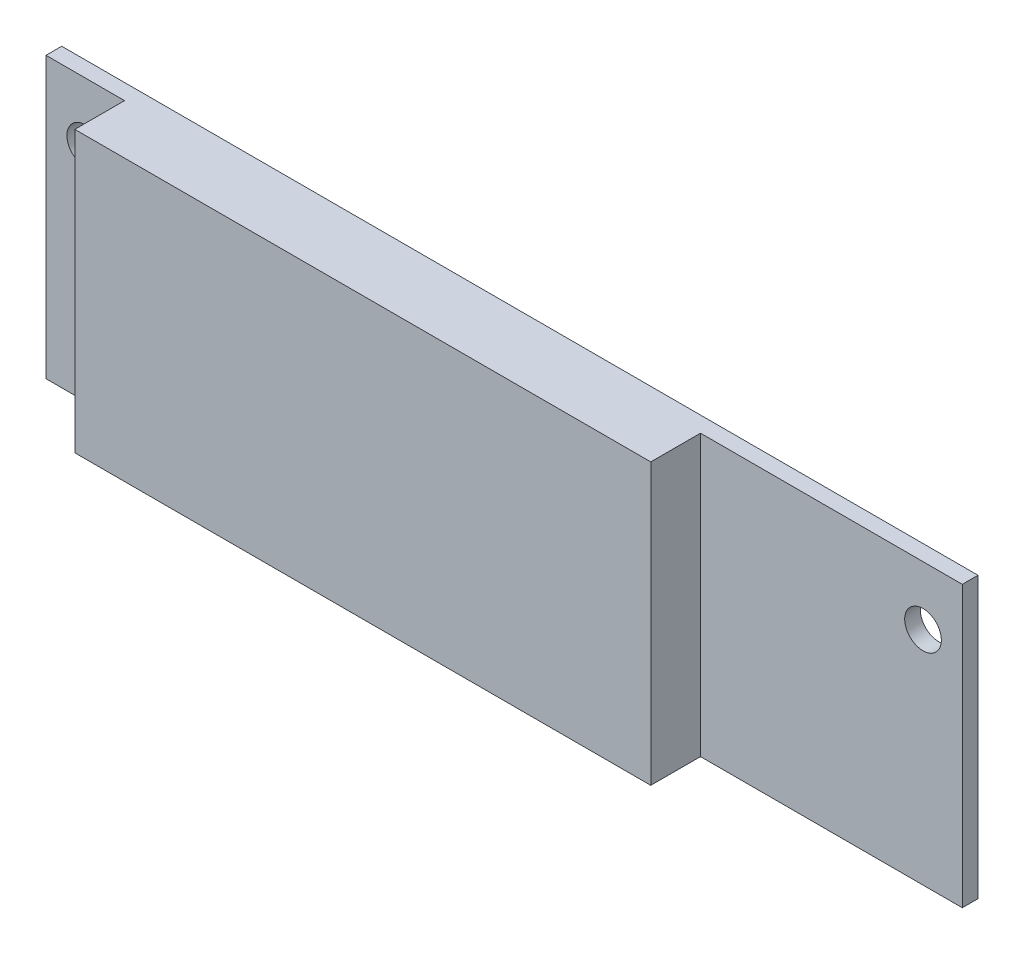
ISO-10303-21;
HEADER;
FILE_DESCRIPTION(('STEP AP214'),'2;1');
FILE_NAME('part.step','',(''),(''),'','','');
FILE_SCHEMA(('AUTOMOTIVE_DESIGN { 1 0 10303 214 1 1 1 1 }'));
ENDSEC;
DATA;
#1=APPLICATION_CONTEXT('core data for automotive mechanical design processes');
#2=APPLICATION_PROTOCOL_DEFINITION('international standard','automotive_design',2000,#1);
#3=PRODUCT_CONTEXT('',#1,'mechanical');
#4=PRODUCT('Part','Part','',(#3));
#5=PRODUCT_RELATED_PRODUCT_CATEGORY('part','',(#4));
#6=PRODUCT_DEFINITION_FORMATION('','',#4);
#7=PRODUCT_DEFINITION_CONTEXT('part definition',#1,'design');
#8=PRODUCT_DEFINITION('design','',#6,#7);
#9=PRODUCT_DEFINITION_SHAPE('','',#8);
#10=(LENGTH_UNIT() NAMED_UNIT(*) SI_UNIT(.MILLI.,.METRE.));
#11=(NAMED_UNIT(*) PLANE_ANGLE_UNIT() SI_UNIT($,.RADIAN.));
#12=(NAMED_UNIT(*) SI_UNIT($,.STERADIAN.) SOLID_ANGLE_UNIT());
#13=UNCERTAINTY_MEASURE_WITH_UNIT(LENGTH_MEASURE(1.E-05),#10,'distance_accuracy_value','');
#14=(GEOMETRIC_REPRESENTATION_CONTEXT(3) GLOBAL_UNCERTAINTY_ASSIGNED_CONTEXT((#13)) GLOBAL_UNIT_ASSIGNED_CONTEXT((#10,
#11,#12)) REPRESENTATION_CONTEXT('',''));
#15=CARTESIAN_POINT('',(0.,0.,0.));
#16=DIRECTION('',(0.,0.,1.));
#17=DIRECTION('',(1.,0.,0.));
#18=AXIS2_PLACEMENT_3D('',#15,#16,#17);
#19=CARTESIAN_POINT('',(35.,28.4,5.));
#20=DIRECTION('',(-1.,0.,0.));
#21=DIRECTION('',(0.,0.,1.));
#22=AXIS2_PLACEMENT_3D('',#19,#20,#21);
#23=PLANE('',#22);
#24=DIRECTION('',(0.,-1.,0.));
#25=VECTOR('',#24,1.);
#26=CARTESIAN_POINT('',(35.,28.4,1.2));
#27=LINE('',#26,#25);
#28=CARTESIAN_POINT('',(35.,28.4,1.2));
#29=VERTEX_POINT('',#28);
#30=CARTESIAN_POINT('',(35.,7.,1.2));
#31=VERTEX_POINT('',#30);
#32=EDGE_CURVE('E175',#29,#31,#27,.T.);
#33=ORIENTED_EDGE('',*,*,#32,.T.);
#34=DIRECTION('',(0.,0.,-1.));
#35=VECTOR('',#34,1.);
#36=CARTESIAN_POINT('',(35.,7.,5.));
#37=LINE('',#36,#35);
#38=CARTESIAN_POINT('',(35.,7.,0.));
#39=VERTEX_POINT('',#38);
#40=EDGE_CURVE('E129',#31,#39,#37,.T.);
#41=ORIENTED_EDGE('',*,*,#40,.T.);
#42=DIRECTION('',(0.,1.,0.));
#43=VECTOR('',#42,1.);
#44=CARTESIAN_POINT('',(35.,28.4,0.));
#45=LINE('',#44,#43);
#46=CARTESIAN_POINT('',(35.,28.4,0.));
#47=VERTEX_POINT('',#46);
#48=EDGE_CURVE('E138',#39,#47,#45,.T.);
#49=ORIENTED_EDGE('',*,*,#48,.T.);
#50=DIRECTION('',(0.,0.,-1.));
#51=VECTOR('',#50,1.);
#52=CARTESIAN_POINT('',(35.,28.4,5.));
#53=LINE('',#52,#51);
#54=EDGE_CURVE('E12',#29,#47,#53,.T.);
#55=ORIENTED_EDGE('',*,*,#54,.F.);
#56=EDGE_LOOP('',(#33,#41,#49,#55));
#57=FACE_BOUND('',#56,.T.);
#58=ADVANCED_FACE('F45',(#57),#23,.F.);
#59=CARTESIAN_POINT('',(-35.,28.4,5.));
#60=DIRECTION('',(1.,0.,0.));
#61=DIRECTION('',(0.,0.,-1.));
#62=AXIS2_PLACEMENT_3D('',#59,#60,#61);
#63=PLANE('',#62);
#64=DIRECTION('',(0.,1.,0.));
#65=VECTOR('',#64,1.);
#66=CARTESIAN_POINT('',(-35.,28.4,1.2));
#67=LINE('',#66,#65);
#68=CARTESIAN_POINT('',(-35.,7.,1.2));
#69=VERTEX_POINT('',#68);
#70=CARTESIAN_POINT('',(-35.,28.4,1.2));
#71=VERTEX_POINT('',#70);
#72=EDGE_CURVE('E155',#69,#71,#67,.T.);
#73=ORIENTED_EDGE('',*,*,#72,.T.);
#74=DIRECTION('',(0.,0.,-1.));
#75=VECTOR('',#74,1.);
#76=CARTESIAN_POINT('',(-35.,28.4,5.));
#77=LINE('',#76,#75);
#78=CARTESIAN_POINT('',(-35.,28.4,0.));
#79=VERTEX_POINT('',#78);
#80=EDGE_CURVE('E52',#71,#79,#77,.T.);
#81=ORIENTED_EDGE('',*,*,#80,.T.);
#82=DIRECTION('',(0.,-1.,0.));
#83=VECTOR('',#82,1.);
#84=CARTESIAN_POINT('',(-35.,28.4,0.));
#85=LINE('',#84,#83);
#86=CARTESIAN_POINT('',(-35.,7.,0.));
#87=VERTEX_POINT('',#86);
#88=EDGE_CURVE('E132',#79,#87,#85,.T.);
#89=ORIENTED_EDGE('',*,*,#88,.T.);
#90=DIRECTION('',(0.,0.,-1.));
#91=VECTOR('',#90,1.);
#92=CARTESIAN_POINT('',(-35.,7.,5.));
#93=LINE('',#92,#91);
#94=EDGE_CURVE('E148',#69,#87,#93,.T.);
#95=ORIENTED_EDGE('',*,*,#94,.F.);
#96=EDGE_LOOP('',(#73,#81,#89,#95));
#97=FACE_BOUND('',#96,.T.);
#98=ADVANCED_FACE('F151',(#97),#63,.F.);
#99=CARTESIAN_POINT('',(-35.,28.4,5.));
#100=DIRECTION('',(0.,-1.,0.));
#101=DIRECTION('',(1.,0.,0.));
#102=AXIS2_PLACEMENT_3D('',#99,#100,#101);
#103=PLANE('',#102);
#104=DIRECTION('',(1.,0.,0.));
#105=VECTOR('',#104,1.);
#106=CARTESIAN_POINT('',(-35.,28.4,1.2));
#107=LINE('',#106,#105);
#108=CARTESIAN_POINT('',(-29.,28.4,1.2));
#109=VERTEX_POINT('',#108);
#110=EDGE_CURVE('E122',#71,#109,#107,.T.);
#111=ORIENTED_EDGE('',*,*,#110,.T.);
#112=DIRECTION('',(0.,0.,1.));
#113=VECTOR('',#112,1.);
#114=CARTESIAN_POINT('',(-29.,28.4,-29.2909542350535));
#115=LINE('',#114,#113);
#116=CARTESIAN_POINT('',(-29.,28.4,5.));
#117=VERTEX_POINT('',#116);
#118=EDGE_CURVE('E109',#109,#117,#115,.T.);
#119=ORIENTED_EDGE('',*,*,#118,.T.);
#120=DIRECTION('',(-1.,0.,0.));
#121=VECTOR('',#120,1.);
#122=CARTESIAN_POINT('',(-35.,28.4,5.));
#123=LINE('',#122,#121);
#124=CARTESIAN_POINT('',(15.,28.4,5.));
#125=VERTEX_POINT('',#124);
#126=EDGE_CURVE('E120',#125,#117,#123,.T.);
#127=ORIENTED_EDGE('',*,*,#126,.F.);
#128=DIRECTION('',(0.,0.,1.));
#129=VECTOR('',#128,1.);
#130=CARTESIAN_POINT('',(15.,28.4,-29.2909542350535));
#131=LINE('',#130,#129);
#132=CARTESIAN_POINT('',(15.,28.4,1.2));
#133=VERTEX_POINT('',#132);
#134=EDGE_CURVE('E67',#133,#125,#131,.T.);
#135=ORIENTED_EDGE('',*,*,#134,.F.);
#136=DIRECTION('',(1.,0.,0.));
#137=VECTOR('',#136,1.);
#138=CARTESIAN_POINT('',(35.,28.4,1.2));
#139=LINE('',#138,#137);
#140=EDGE_CURVE('E173',#133,#29,#139,.T.);
#141=ORIENTED_EDGE('',*,*,#140,.T.);
#142=ORIENTED_EDGE('',*,*,#54,.T.);
#143=DIRECTION('',(-1.,0.,0.));
#144=VECTOR('',#143,1.);
#145=CARTESIAN_POINT('',(-35.,28.4,0.));
#146=LINE('',#145,#144);
#147=EDGE_CURVE('E141',#47,#79,#146,.T.);
#148=ORIENTED_EDGE('',*,*,#147,.T.);
#149=ORIENTED_EDGE('',*,*,#80,.F.);
#150=EDGE_LOOP('',(#111,#119,#127,#135,#141,#142,#148,#149));
#151=FACE_BOUND('',#150,.T.);
#152=ADVANCED_FACE('F119',(#151),#103,.F.);
#153=CARTESIAN_POINT('',(-35.,7.,5.));
#154=DIRECTION('',(0.,1.,0.));
#155=DIRECTION('',(0.,0.,1.));
#156=AXIS2_PLACEMENT_3D('',#153,#154,#155);
#157=PLANE('',#156);
#158=DIRECTION('',(1.,0.,0.));
#159=VECTOR('',#158,1.);
#160=CARTESIAN_POINT('',(-35.,7.,5.));
#161=LINE('',#160,#159);
#162=CARTESIAN_POINT('',(-29.,7.,5.));
#163=VERTEX_POINT('',#162);
#164=CARTESIAN_POINT('',(15.,7.,5.));
#165=VERTEX_POINT('',#164);
#166=EDGE_CURVE('E126',#163,#165,#161,.T.);
#167=ORIENTED_EDGE('',*,*,#166,.F.);
#168=DIRECTION('',(0.,0.,1.));
#169=VECTOR('',#168,1.);
#170=CARTESIAN_POINT('',(-29.,7.,-29.2909542350535));
#171=LINE('',#170,#169);
#172=CARTESIAN_POINT('',(-29.,7.,1.2));
#173=VERTEX_POINT('',#172);
#174=EDGE_CURVE('E59',#173,#163,#171,.T.);
#175=ORIENTED_EDGE('',*,*,#174,.F.);
#176=DIRECTION('',(-1.,0.,0.));
#177=VECTOR('',#176,1.);
#178=CARTESIAN_POINT('',(-35.,7.,1.2));
#179=LINE('',#178,#177);
#180=EDGE_CURVE('E142',#173,#69,#179,.T.);
#181=ORIENTED_EDGE('',*,*,#180,.T.);
#182=ORIENTED_EDGE('',*,*,#94,.T.);
#183=DIRECTION('',(1.,0.,0.));
#184=VECTOR('',#183,1.);
#185=CARTESIAN_POINT('',(-35.,7.,0.));
#186=LINE('',#185,#184);
#187=EDGE_CURVE('E127',#87,#39,#186,.T.);
#188=ORIENTED_EDGE('',*,*,#187,.T.);
#189=ORIENTED_EDGE('',*,*,#40,.F.);
#190=DIRECTION('',(-1.,0.,0.));
#191=VECTOR('',#190,1.);
#192=CARTESIAN_POINT('',(35.,7.,1.2));
#193=LINE('',#192,#191);
#194=CARTESIAN_POINT('',(15.,7.,1.2));
#195=VERTEX_POINT('',#194);
#196=EDGE_CURVE('E183',#31,#195,#193,.T.);
#197=ORIENTED_EDGE('',*,*,#196,.T.);
#198=DIRECTION('',(0.,0.,1.));
#199=VECTOR('',#198,1.);
#200=CARTESIAN_POINT('',(15.,7.,-29.2909542350535));
#201=LINE('',#200,#199);
#202=EDGE_CURVE('E178',#195,#165,#201,.T.);
#203=ORIENTED_EDGE('',*,*,#202,.T.);
#204=EDGE_LOOP('',(#167,#175,#181,#182,#188,#189,#197,#203));
#205=FACE_BOUND('',#204,.T.);
#206=ADVANCED_FACE('F164',(#205),#157,.F.);
#207=CARTESIAN_POINT('',(0.,0.,5.));
#208=DIRECTION('',(0.,0.,1.));
#209=DIRECTION('',(1.,0.,0.));
#210=AXIS2_PLACEMENT_3D('',#207,#208,#209);
#211=PLANE('',#210);
#212=DIRECTION('',(0.,1.,0.));
#213=VECTOR('',#212,1.);
#214=CARTESIAN_POINT('',(-29.,28.4,5.));
#215=LINE('',#214,#213);
#216=EDGE_CURVE('E106',#163,#117,#215,.T.);
#217=ORIENTED_EDGE('',*,*,#216,.F.);
#218=ORIENTED_EDGE('',*,*,#166,.T.);
#219=DIRECTION('',(0.,-1.,0.));
#220=VECTOR('',#219,1.);
#221=CARTESIAN_POINT('',(15.,28.4,5.));
#222=LINE('',#221,#220);
#223=EDGE_CURVE('E115',#125,#165,#222,.T.);
#224=ORIENTED_EDGE('',*,*,#223,.F.);
#225=ORIENTED_EDGE('',*,*,#126,.T.);
#226=EDGE_LOOP('',(#217,#218,#224,#225));
#227=FACE_BOUND('',#226,.T.);
#228=ADVANCED_FACE('F125',(#227),#211,.T.);
#229=CARTESIAN_POINT('',(0.,0.,0.));
#230=DIRECTION('',(0.,0.,1.));
#231=DIRECTION('',(1.,0.,0.));
#232=AXIS2_PLACEMENT_3D('',#229,#230,#231);
#233=PLANE('',#232);
#234=CARTESIAN_POINT('',(32.,23.9,0.));
#235=DIRECTION('',(0.,0.,1.));
#236=DIRECTION('',(1.,0.,0.));
#237=AXIS2_PLACEMENT_3D('',#234,#235,#236);
#238=CIRCLE('',#237,1.4);
#239=CARTESIAN_POINT('',(33.4,23.9,0.));
#240=VERTEX_POINT('',#239);
#241=EDGE_CURVE('E176',#240,#240,#238,.T.);
#242=ORIENTED_EDGE('',*,*,#241,.T.);
#243=EDGE_LOOP('',(#242));
#244=FACE_BOUND('',#243,.T.);
#245=CARTESIAN_POINT('',(-32.,23.9,0.));
#246=DIRECTION('',(0.,0.,1.));
#247=DIRECTION('',(1.,0.,0.));
#248=AXIS2_PLACEMENT_3D('',#245,#246,#247);
#249=CIRCLE('',#248,1.4);
#250=CARTESIAN_POINT('',(-30.6,23.9,0.));
#251=VERTEX_POINT('',#250);
#252=EDGE_CURVE('E236',#251,#251,#249,.T.);
#253=ORIENTED_EDGE('',*,*,#252,.T.);
#254=EDGE_LOOP('',(#253));
#255=FACE_BOUND('',#254,.T.);
#256=ORIENTED_EDGE('',*,*,#48,.F.);
#257=ORIENTED_EDGE('',*,*,#187,.F.);
#258=ORIENTED_EDGE('',*,*,#88,.F.);
#259=ORIENTED_EDGE('',*,*,#147,.F.);
#260=EDGE_LOOP('',(#256,#257,#258,#259));
#261=FACE_BOUND('',#260,.T.);
#262=ADVANCED_FACE('F161',(#244,#255,#261),#233,.F.);
#263=CARTESIAN_POINT('',(15.,28.4,-29.2909542350535));
#264=DIRECTION('',(-1.,0.,0.));
#265=DIRECTION('',(0.,-1.,0.));
#266=AXIS2_PLACEMENT_3D('',#263,#264,#265);
#267=PLANE('',#266);
#268=DIRECTION('',(0.,1.,0.));
#269=VECTOR('',#268,1.);
#270=CARTESIAN_POINT('',(15.,28.4,1.2));
#271=LINE('',#270,#269);
#272=EDGE_CURVE('E135',#195,#133,#271,.T.);
#273=ORIENTED_EDGE('',*,*,#272,.T.);
#274=ORIENTED_EDGE('',*,*,#134,.T.);
#275=ORIENTED_EDGE('',*,*,#223,.T.);
#276=ORIENTED_EDGE('',*,*,#202,.F.);
#277=EDGE_LOOP('',(#273,#274,#275,#276));
#278=FACE_BOUND('',#277,.T.);
#279=ADVANCED_FACE('F186',(#278),#267,.F.);
#280=CARTESIAN_POINT('',(0.,0.,1.2));
#281=DIRECTION('',(0.,0.,1.));
#282=DIRECTION('',(1.,0.,0.));
#283=AXIS2_PLACEMENT_3D('',#280,#281,#282);
#284=PLANE('',#283);
#285=CARTESIAN_POINT('',(32.,23.9,1.2));
#286=DIRECTION('',(0.,0.,1.));
#287=DIRECTION('',(1.,0.,0.));
#288=AXIS2_PLACEMENT_3D('',#285,#286,#287);
#289=CIRCLE('',#288,1.4);
#290=CARTESIAN_POINT('',(33.4,23.9,1.2));
#291=VERTEX_POINT('',#290);
#292=EDGE_CURVE('E231',#291,#291,#289,.T.);
#293=ORIENTED_EDGE('',*,*,#292,.F.);
#294=EDGE_LOOP('',(#293));
#295=FACE_BOUND('',#294,.T.);
#296=ORIENTED_EDGE('',*,*,#32,.F.);
#297=ORIENTED_EDGE('',*,*,#140,.F.);
#298=ORIENTED_EDGE('',*,*,#272,.F.);
#299=ORIENTED_EDGE('',*,*,#196,.F.);
#300=EDGE_LOOP('',(#296,#297,#298,#299));
#301=FACE_BOUND('',#300,.T.);
#302=ADVANCED_FACE('F188',(#295,#301),#284,.T.);
#303=CARTESIAN_POINT('',(-29.,28.4,-29.2909542350535));
#304=DIRECTION('',(1.,0.,0.));
#305=DIRECTION('',(0.,1.,0.));
#306=AXIS2_PLACEMENT_3D('',#303,#304,#305);
#307=PLANE('',#306);
#308=DIRECTION('',(0.,-1.,0.));
#309=VECTOR('',#308,1.);
#310=CARTESIAN_POINT('',(-29.,28.4,1.2));
#311=LINE('',#310,#309);
#312=EDGE_CURVE('E123',#109,#173,#311,.T.);
#313=ORIENTED_EDGE('',*,*,#312,.T.);
#314=ORIENTED_EDGE('',*,*,#174,.T.);
#315=ORIENTED_EDGE('',*,*,#216,.T.);
#316=ORIENTED_EDGE('',*,*,#118,.F.);
#317=EDGE_LOOP('',(#313,#314,#315,#316));
#318=FACE_BOUND('',#317,.T.);
#319=ADVANCED_FACE('F108',(#318),#307,.F.);
#320=CARTESIAN_POINT('',(0.,0.,1.2));
#321=DIRECTION('',(0.,0.,1.));
#322=DIRECTION('',(1.,0.,0.));
#323=AXIS2_PLACEMENT_3D('',#320,#321,#322);
#324=PLANE('',#323);
#325=CARTESIAN_POINT('',(-32.,23.9,1.2));
#326=DIRECTION('',(0.,0.,1.));
#327=DIRECTION('',(1.,0.,0.));
#328=AXIS2_PLACEMENT_3D('',#325,#326,#327);
#329=CIRCLE('',#328,1.4);
#330=CARTESIAN_POINT('',(-30.6,23.9,1.2));
#331=VERTEX_POINT('',#330);
#332=EDGE_CURVE('E232',#331,#331,#329,.T.);
#333=ORIENTED_EDGE('',*,*,#332,.F.);
#334=EDGE_LOOP('',(#333));
#335=FACE_BOUND('',#334,.T.);
#336=ORIENTED_EDGE('',*,*,#72,.F.);
#337=ORIENTED_EDGE('',*,*,#180,.F.);
#338=ORIENTED_EDGE('',*,*,#312,.F.);
#339=ORIENTED_EDGE('',*,*,#110,.F.);
#340=EDGE_LOOP('',(#336,#337,#338,#339));
#341=FACE_BOUND('',#340,.T.);
#342=ADVANCED_FACE('F213',(#335,#341),#324,.T.);
#343=CARTESIAN_POINT('',(-32.,23.9,0.));
#344=DIRECTION('',(0.,0.,1.));
#345=DIRECTION('',(1.,0.,0.));
#346=AXIS2_PLACEMENT_3D('',#343,#344,#345);
#347=CYLINDRICAL_SURFACE('',#346,1.4);
#348=ORIENTED_EDGE('',*,*,#252,.F.);
#349=EDGE_LOOP('',(#348));
#350=FACE_BOUND('',#349,.T.);
#351=ORIENTED_EDGE('',*,*,#332,.T.);
#352=EDGE_LOOP('',(#351));
#353=FACE_BOUND('',#352,.T.);
#354=ADVANCED_FACE('F216',(#350,#353),#347,.F.);
#355=CARTESIAN_POINT('',(32.,23.9,0.));
#356=DIRECTION('',(0.,0.,1.));
#357=DIRECTION('',(1.,0.,0.));
#358=AXIS2_PLACEMENT_3D('',#355,#356,#357);
#359=CYLINDRICAL_SURFACE('',#358,1.4);
#360=ORIENTED_EDGE('',*,*,#241,.F.);
#361=EDGE_LOOP('',(#360));
#362=FACE_BOUND('',#361,.T.);
#363=ORIENTED_EDGE('',*,*,#292,.T.);
#364=EDGE_LOOP('',(#363));
#365=FACE_BOUND('',#364,.T.);
#366=ADVANCED_FACE('F220',(#362,#365),#359,.F.);
#367=CLOSED_SHELL('',(#58,#98,#152,#206,#228,#262,#279,#302,#319,#342,#354,#366));
#368=MANIFOLD_SOLID_BREP('B2',#367);
#369=ADVANCED_BREP_SHAPE_REPRESENTATION('',(#18,#368),#14);
#370=SHAPE_DEFINITION_REPRESENTATION(#9,#369);
ENDSEC;
END-ISO-10303-21;
